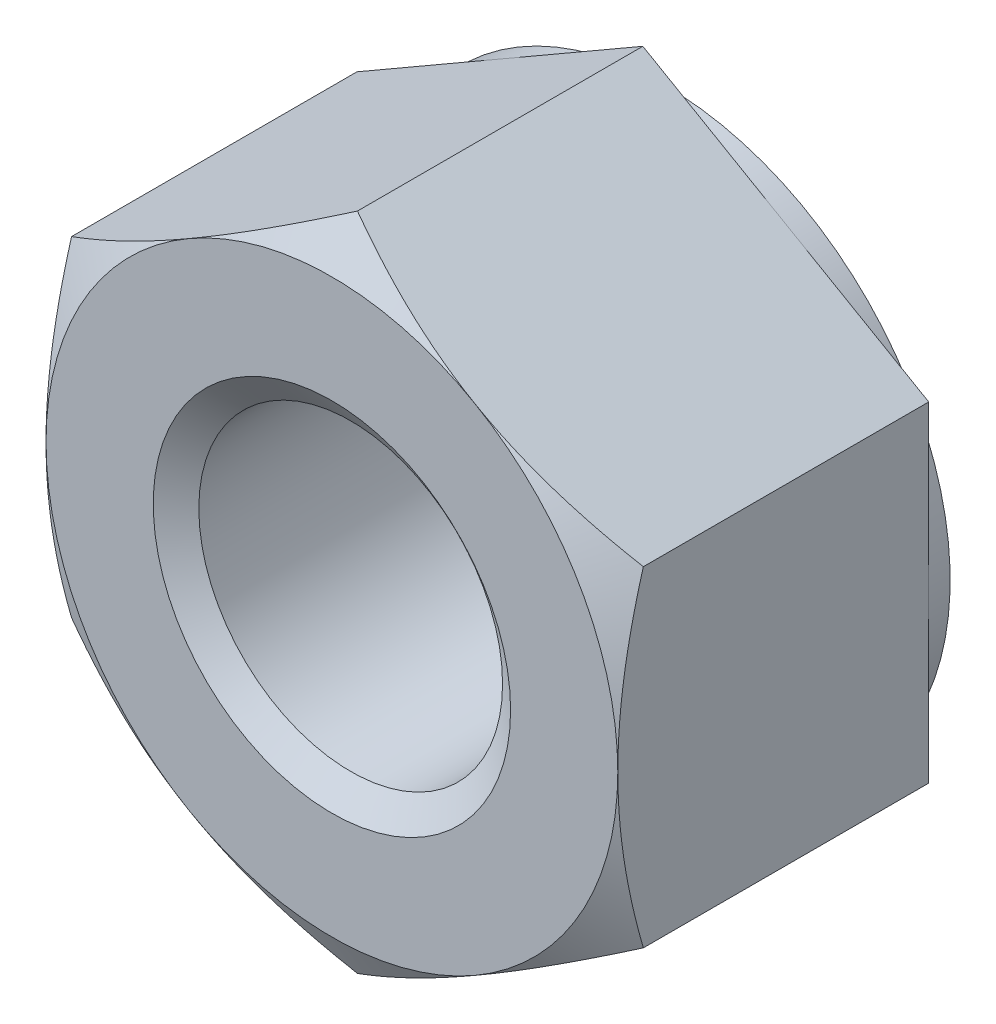
ISO-10303-21;
HEADER;
FILE_DESCRIPTION(('STEP AP214'),'2;1');
FILE_NAME('part.step','',(''),(''),'','','');
FILE_SCHEMA(('AUTOMOTIVE_DESIGN { 1 0 10303 214 1 1 1 1 }'));
ENDSEC;
DATA;
#1=APPLICATION_CONTEXT('core data for automotive mechanical design processes');
#2=APPLICATION_PROTOCOL_DEFINITION('international standard','automotive_design',2000,#1);
#3=PRODUCT_CONTEXT('',#1,'mechanical');
#4=PRODUCT('Part','Part','',(#3));
#5=PRODUCT_RELATED_PRODUCT_CATEGORY('part','',(#4));
#6=PRODUCT_DEFINITION_FORMATION('','',#4);
#7=PRODUCT_DEFINITION_CONTEXT('part definition',#1,'design');
#8=PRODUCT_DEFINITION('design','',#6,#7);
#9=PRODUCT_DEFINITION_SHAPE('','',#8);
#10=(LENGTH_UNIT() NAMED_UNIT(*) SI_UNIT(.MILLI.,.METRE.));
#11=(NAMED_UNIT(*) PLANE_ANGLE_UNIT() SI_UNIT($,.RADIAN.));
#12=(NAMED_UNIT(*) SI_UNIT($,.STERADIAN.) SOLID_ANGLE_UNIT());
#13=UNCERTAINTY_MEASURE_WITH_UNIT(LENGTH_MEASURE(1.E-05),#10,'distance_accuracy_value','');
#14=(GEOMETRIC_REPRESENTATION_CONTEXT(3) GLOBAL_UNCERTAINTY_ASSIGNED_CONTEXT((#13)) GLOBAL_UNIT_ASSIGNED_CONTEXT((#10,
#11,#12)) REPRESENTATION_CONTEXT('',''));
#15=CARTESIAN_POINT('',(0.,0.,0.));
#16=DIRECTION('',(0.,0.,1.));
#17=DIRECTION('',(1.,0.,0.));
#18=AXIS2_PLACEMENT_3D('',#15,#16,#17);
#19=CARTESIAN_POINT('',(0.,0.,-9.3));
#20=DIRECTION('',(0.,0.,1.));
#21=DIRECTION('',(1.,0.,0.));
#22=AXIS2_PLACEMENT_3D('',#19,#20,#21);
#23=CYLINDRICAL_SURFACE('',#22,4.25);
#24=CARTESIAN_POINT('',(0.,0.,-0.525155653657278));
#25=DIRECTION('',(0.,0.,1.));
#26=DIRECTION('',(1.,0.,0.));
#27=AXIS2_PLACEMENT_3D('',#24,#25,#26);
#28=CIRCLE('',#27,4.25);
#29=CARTESIAN_POINT('',(4.25,0.,-0.525155653657278));
#30=VERTEX_POINT('',#29);
#31=EDGE_CURVE('E154',#30,#30,#28,.F.);
#32=ORIENTED_EDGE('',*,*,#31,.F.);
#33=EDGE_LOOP('',(#32));
#34=FACE_BOUND('',#33,.T.);
#35=CARTESIAN_POINT('',(0.,0.,-8.74944434634271));
#36=DIRECTION('',(0.,0.,-1.));
#37=DIRECTION('',(-1.,0.,0.));
#38=AXIS2_PLACEMENT_3D('',#35,#36,#37);
#39=CIRCLE('',#38,4.25);
#40=CARTESIAN_POINT('',(-4.25,0.,-8.74944434634271));
#41=VERTEX_POINT('',#40);
#42=EDGE_CURVE('E42',#41,#41,#39,.F.);
#43=ORIENTED_EDGE('',*,*,#42,.F.);
#44=EDGE_LOOP('',(#43));
#45=FACE_BOUND('',#44,.T.);
#46=ADVANCED_FACE('F37',(#34,#45),#23,.F.);
#47=CARTESIAN_POINT('',(0.,9.23760430703403,-9.3));
#48=DIRECTION('',(-0.500000000000002,0.866025403784438,0.));
#49=DIRECTION('',(-0.866025403784438,-0.500000000000002,0.));
#50=AXIS2_PLACEMENT_3D('',#47,#48,#49);
#51=PLANE('',#50);
#52=DIRECTION('',(0.,0.,1.));
#53=VECTOR('',#52,1.);
#54=CARTESIAN_POINT('',(-8.,4.618802153517,-9.3));
#55=LINE('',#54,#53);
#56=CARTESIAN_POINT('',(-8.,4.618802153517,-8.7));
#57=VERTEX_POINT('',#56);
#58=CARTESIAN_POINT('',(-8.,4.618802153517,-0.714531179816336));
#59=VERTEX_POINT('',#58);
#60=EDGE_CURVE('E295',#57,#59,#55,.T.);
#61=ORIENTED_EDGE('',*,*,#60,.T.);
#62=CARTESIAN_POINT('',(-8.0002,4.61868668346316,-0.714597847732977));
#63=CARTESIAN_POINT('',(-7.8243512161201,4.72021302617289,-0.655990714047301));
#64=CARTESIAN_POINT('',(-7.64784680569387,4.82211789504563,-0.600043401047293));
#65=CARTESIAN_POINT('',(-7.29340453712154,5.02675523421805,-0.494201005024668));
#66=CARTESIAN_POINT('',(-7.11546609530729,5.12948804149869,-0.444308534431068));
#67=CARTESIAN_POINT('',(-6.57880176237736,5.43933133858026,-0.304692797206866));
#68=CARTESIAN_POINT('',(-6.21795741776428,5.64766491807817,-0.225281170978368));
#69=CARTESIAN_POINT('',(-5.67796082979595,5.95943209350317,-0.132161646294488));
#70=CARTESIAN_POINT('',(-5.50042181035672,6.06193429416807,-0.105634581029124));
#71=CARTESIAN_POINT('',(-5.1445408870398,6.26740224104454,-0.0611531748588752));
#72=CARTESIAN_POINT('',(-4.96619905550676,6.37036794548792,-0.043198076514579));
#73=CARTESIAN_POINT('',(-4.60920831517641,6.57647664551585,-0.0163156484918642));
#74=CARTESIAN_POINT('',(-4.4305599863905,6.67961930623067,-0.00737807354623307));
#75=CARTESIAN_POINT('',(-4.07309829490262,6.88599991003618,0.0012776960348698));
#76=CARTESIAN_POINT('',(-3.89428493746994,6.98923785008464,0.000996175497150101));
#77=CARTESIAN_POINT('',(-3.5599866329831,7.18224506616975,-0.00814502526877561));
#78=CARTESIAN_POINT('',(-3.40447809566133,7.27202796205376,-0.0158896043673698));
#79=CARTESIAN_POINT('',(-3.09382523825949,7.45138347289924,-0.0382011348534291));
#80=CARTESIAN_POINT('',(-2.93868094344,7.54095607327651,-0.0527685461381489));
#81=CARTESIAN_POINT('',(-2.47384868410518,7.80932710333149,-0.106360690527539));
#82=CARTESIAN_POINT('',(-2.16498351281828,7.98765049311728,-0.155268641669147));
#83=CARTESIAN_POINT('',(-1.5439767712397,8.34618890253625,-0.277539403234318));
#84=CARTESIAN_POINT('',(-1.23191445788552,8.52635816315522,-0.351420520376005));
#85=CARTESIAN_POINT('',(-0.612443518305235,8.88400987687705,-0.51910014125498));
#86=CARTESIAN_POINT('',(-0.305026959108242,9.06149691008278,-0.612859260854465));
#87=CARTESIAN_POINT('',(0.000200000000006873,9.23771977708786,-0.714597847732987));
#88=B_SPLINE_CURVE_WITH_KNOTS('',3,(#62,#63,#64,#65,#66,#67,#68,#69,#70,#71,#72,#73,#74,#75,#76,
#77,#78,#79,#80,#81,#82,#83,#84,#85,#86,#87),.UNSPECIFIED.,.F.,.F.,(4,2,2,2,2,2,2,2,2,2,2,2,4),
(0.,0.633973543721351,1.26821965714356,2.53934712434766,3.15934343977049,3.77928496069784,
4.39852133866766,5.01773858515595,5.55680239410249,6.09590254421148,7.17487077411836,
8.27776850154294,9.37850115249056),.UNSPECIFIED.);
#89=CARTESIAN_POINT('',(-4.00000000000001,6.9282032302755,0.));
#90=VERTEX_POINT('',#89);
#91=EDGE_CURVE('E61',#59,#90,#88,.T.);
#92=ORIENTED_EDGE('',*,*,#91,.T.);
#93=CARTESIAN_POINT('',(0.,9.23760430703403,-0.714531179816336));
#94=VERTEX_POINT('',#93);
#95=EDGE_CURVE('E168',#90,#94,#88,.T.);
#96=ORIENTED_EDGE('',*,*,#95,.T.);
#97=DIRECTION('',(0.,0.,1.));
#98=VECTOR('',#97,1.);
#99=CARTESIAN_POINT('',(0.,9.23760430703403,-9.3));
#100=LINE('',#99,#98);
#101=CARTESIAN_POINT('',(0.,9.23760430703403,-8.7));
#102=VERTEX_POINT('',#101);
#103=EDGE_CURVE('E283',#102,#94,#100,.T.);
#104=ORIENTED_EDGE('',*,*,#103,.F.);
#105=DIRECTION('',(-0.866025403784438,-0.500000000000002,0.));
#106=VECTOR('',#105,1.);
#107=CARTESIAN_POINT('',(0.,9.23760430703403,-8.7));
#108=LINE('',#107,#106);
#109=CARTESIAN_POINT('',(-4.00000000000001,6.9282032302755,-8.7));
#110=VERTEX_POINT('',#109);
#111=EDGE_CURVE('E271',#102,#110,#108,.T.);
#112=ORIENTED_EDGE('',*,*,#111,.T.);
#113=EDGE_CURVE('E267',#110,#57,#108,.T.);
#114=ORIENTED_EDGE('',*,*,#113,.T.);
#115=EDGE_LOOP('',(#61,#92,#96,#104,#112,#114));
#116=FACE_BOUND('',#115,.T.);
#117=ADVANCED_FACE('F39',(#116),#51,.T.);
#118=CARTESIAN_POINT('',(8.,4.61880215351699,-9.3));
#119=DIRECTION('',(0.500000000000003,0.866025403784437,0.));
#120=DIRECTION('',(-0.866025403784437,0.500000000000003,0.));
#121=AXIS2_PLACEMENT_3D('',#118,#119,#120);
#122=PLANE('',#121);
#123=ORIENTED_EDGE('',*,*,#103,.T.);
#124=CARTESIAN_POINT('',(-0.000199999999993257,9.23771977708786,-0.714597847732987));
#125=CARTESIAN_POINT('',(0.175648783879903,9.13619343437814,-0.655990714047311));
#126=CARTESIAN_POINT('',(0.352153194306141,9.03428856550539,-0.600043401047303));
#127=CARTESIAN_POINT('',(0.706595462878466,8.82965122633298,-0.494201005024677));
#128=CARTESIAN_POINT('',(0.884533904692719,8.72691841905234,-0.444308534431076));
#129=CARTESIAN_POINT('',(1.42119823762265,8.41707512197076,-0.304692797206873));
#130=CARTESIAN_POINT('',(1.78204258223573,8.20874154247285,-0.225281170978374));
#131=CARTESIAN_POINT('',(2.32203917020406,7.89697436704785,-0.132161646294492));
#132=CARTESIAN_POINT('',(2.49957818964329,7.79447216638295,-0.105634581029127));
#133=CARTESIAN_POINT('',(2.85545911296021,7.58900421950647,-0.0611531748588777));
#134=CARTESIAN_POINT('',(3.03380094449325,7.4860385150631,-0.0431980765145816));
#135=CARTESIAN_POINT('',(3.3907916848236,7.27992981503516,-0.0163156484918657));
#136=CARTESIAN_POINT('',(3.56944001360951,7.17678715432034,-0.0073780735462332));
#137=CARTESIAN_POINT('',(3.92690170509739,6.97040655051483,0.00127769603487092));
#138=CARTESIAN_POINT('',(4.10571506253007,6.86716861046637,0.000996175497151226));
#139=CARTESIAN_POINT('',(4.44001336701691,6.67416139438126,-0.00814502526877447));
#140=CARTESIAN_POINT('',(4.59552190433868,6.58437849849725,-0.0158896043673686));
#141=CARTESIAN_POINT('',(4.90617476174052,6.40502298765177,-0.0382011348534268));
#142=CARTESIAN_POINT('',(5.06131905656,6.31545038727451,-0.0527685461381455));
#143=CARTESIAN_POINT('',(5.52615131589482,6.04707935721953,-0.106360690527533));
#144=CARTESIAN_POINT('',(5.83501648718172,5.86875596743373,-0.155268641669142));
#145=CARTESIAN_POINT('',(6.4560232287603,5.51021755801476,-0.277539403234311));
#146=CARTESIAN_POINT('',(6.76808554211448,5.33004829739579,-0.351420520375996));
#147=CARTESIAN_POINT('',(7.38755648169476,4.97239658367396,-0.519100141254968));
#148=CARTESIAN_POINT('',(7.69497304089175,4.79490955046823,-0.612859260854452));
#149=CARTESIAN_POINT('',(8.0002,4.61868668346315,-0.714597847732974));
#150=B_SPLINE_CURVE_WITH_KNOTS('',3,(#124,#125,#126,#127,#128,#129,#130,#131,#132,#133,#134,
#135,#136,#137,#138,#139,#140,#141,#142,#143,#144,#145,#146,#147,#148,#149),.UNSPECIFIED.,.F.,
.F.,(4,2,2,2,2,2,2,2,2,2,2,2,4),(0.,0.633973543721352,1.26821965714356,2.53934712434766,
3.1593434397705,3.77928496069785,4.39852133866767,5.01773858515596,5.5568023941025,
6.09590254421149,7.17487077411836,8.27776850154294,9.37850115249056),.UNSPECIFIED.);
#151=CARTESIAN_POINT('',(4.00000000000002,6.9282032302755,0.));
#152=VERTEX_POINT('',#151);
#153=EDGE_CURVE('E165',#94,#152,#150,.T.);
#154=ORIENTED_EDGE('',*,*,#153,.T.);
#155=CARTESIAN_POINT('',(8.,4.61880215351703,-0.714531179816336));
#156=VERTEX_POINT('',#155);
#157=EDGE_CURVE('E148',#152,#156,#150,.T.);
#158=ORIENTED_EDGE('',*,*,#157,.T.);
#159=DIRECTION('',(0.,0.,1.));
#160=VECTOR('',#159,1.);
#161=CARTESIAN_POINT('',(8.,4.61880215351699,-9.3));
#162=LINE('',#161,#160);
#163=CARTESIAN_POINT('',(8.,4.61880215351699,-8.7));
#164=VERTEX_POINT('',#163);
#165=EDGE_CURVE('E164',#164,#156,#162,.T.);
#166=ORIENTED_EDGE('',*,*,#165,.F.);
#167=DIRECTION('',(-0.866025403784437,0.500000000000003,0.));
#168=VECTOR('',#167,1.);
#169=CARTESIAN_POINT('',(8.,4.61880215351699,-8.7));
#170=LINE('',#169,#168);
#171=CARTESIAN_POINT('',(4.00000000000002,6.9282032302755,-8.7));
#172=VERTEX_POINT('',#171);
#173=EDGE_CURVE('E279',#164,#172,#170,.T.);
#174=ORIENTED_EDGE('',*,*,#173,.T.);
#175=EDGE_CURVE('E275',#172,#102,#170,.T.);
#176=ORIENTED_EDGE('',*,*,#175,.T.);
#177=EDGE_LOOP('',(#123,#154,#158,#166,#174,#176));
#178=FACE_BOUND('',#177,.T.);
#179=ADVANCED_FACE('F242',(#178),#122,.T.);
#180=CARTESIAN_POINT('',(8.,4.61880215351699,-9.3));
#181=DIRECTION('',(-1.,0.,0.));
#182=DIRECTION('',(0.,0.,1.));
#183=AXIS2_PLACEMENT_3D('',#180,#181,#182);
#184=PLANE('',#183);
#185=CARTESIAN_POINT('',(8.,-12.2497439799177,-3.82821364248122));
#186=CARTESIAN_POINT('',(8.,-11.8984987351193,-3.65847254218266));
#187=CARTESIAN_POINT('',(8.,-11.5464230390783,-3.49041880793923));
#188=CARTESIAN_POINT('',(8.,-10.8401616983868,-3.15865029326974));
#189=CARTESIAN_POINT('',(8.,-10.4859757012546,-2.99493626408528));
#190=CARTESIAN_POINT('',(8.,-9.77313142803814,-2.67194892676994));
#191=CARTESIAN_POINT('',(8.,-9.41445915782848,-2.51270639241668));
#192=CARTESIAN_POINT('',(8.,-8.69416671490287,-2.20106116855006));
#193=CARTESIAN_POINT('',(8.,-8.33254669701139,-2.04865812250699));
#194=CARTESIAN_POINT('',(8.,-7.60129405984857,-1.7507013094022));
#195=CARTESIAN_POINT('',(8.,-7.2316175748596,-1.60525460075004));
#196=CARTESIAN_POINT('',(8.,-6.48790521752629,-1.32575242959684));
#197=CARTESIAN_POINT('',(8.,-6.11386886541895,-1.19169823445334));
#198=CARTESIAN_POINT('',(8.,-5.36160531585215,-0.938583617279796));
#199=CARTESIAN_POINT('',(8.,-4.98338896232053,-0.819491318535674));
#200=CARTESIAN_POINT('',(8.,-4.2215930034141,-0.600166264263341));
#201=CARTESIAN_POINT('',(8.,-3.83801513546607,-0.499927544676865));
#202=CARTESIAN_POINT('',(8.,-3.06517005833209,-0.323183265030146));
#203=CARTESIAN_POINT('',(8.,-2.67590136311897,-0.246684024227884));
#204=CARTESIAN_POINT('',(8.,-2.08857290362252,-0.153570158514917));
#205=CARTESIAN_POINT('',(8.,-1.89220175174279,-0.126136015174347));
#206=CARTESIAN_POINT('',(8.,-1.49853877384916,-0.0790191845115878));
#207=CARTESIAN_POINT('',(8.,-1.3012470409403,-0.0593357297923793));
#208=CARTESIAN_POINT('',(8.,-0.907261125171482,-0.0282499846394219));
#209=CARTESIAN_POINT('',(8.,-0.710571016085392,-0.0167962708107608));
#210=CARTESIAN_POINT('',(8.,-0.316882268583081,-0.0022305633436852));
#211=CARTESIAN_POINT('',(8.,-0.119883634206744,0.000881538622463729));
#212=CARTESIAN_POINT('',(8.,0.274012171056974,-0.00131013187964857));
#213=CARTESIAN_POINT('',(8.,0.47090935490336,-0.00661154245623651));
#214=CARTESIAN_POINT('',(8.,0.8643086583796,-0.0254984060979545));
#215=CARTESIAN_POINT('',(8.,1.06081075778876,-0.0390842728575164));
#216=CARTESIAN_POINT('',(8.,1.53707134445822,-0.0817685231184888));
#217=CARTESIAN_POINT('',(8.,1.81646391313846,-0.115017715431789));
#218=CARTESIAN_POINT('',(8.,2.37310809107455,-0.196418304991677));
#219=CARTESIAN_POINT('',(8.,2.65035909476176,-0.244573769774452));
#220=CARTESIAN_POINT('',(8.,3.20249141370949,-0.354078983931477));
#221=CARTESIAN_POINT('',(8.,3.47737023104608,-0.41544120858484));
#222=CARTESIAN_POINT('',(8.,4.02429975324249,-0.549487708331676));
#223=CARTESIAN_POINT('',(8.,4.29635072195127,-0.622170916833577));
#224=CARTESIAN_POINT('',(8.,4.84432510211611,-0.779020451442163));
#225=CARTESIAN_POINT('',(8.,5.12017997476409,-0.863424582160065));
#226=CARTESIAN_POINT('',(8.,5.6689739270833,-1.04057245964238));
#227=CARTESIAN_POINT('',(8.,5.94191487461246,-1.13331045423936));
#228=CARTESIAN_POINT('',(8.,6.48378576423056,-1.32521046517734));
#229=CARTESIAN_POINT('',(8.,6.7527296356523,-1.42433338468805));
#230=CARTESIAN_POINT('',(8.,7.28853074702745,-1.628397174615));
#231=CARTESIAN_POINT('',(8.,7.55538709319937,-1.73334039644852));
#232=CARTESIAN_POINT('',(8.,7.82127397973352,-1.84061801308352));
#233=B_SPLINE_CURVE_WITH_KNOTS('',3,(#185,#186,#187,#188,#189,#190,#191,#192,#193,#194,#195,
#196,#197,#198,#199,#200,#201,#202,#203,#204,#205,#206,#207,#208,#209,#210,#211,#212,#213,#214,
#215,#216,#217,#218,#219,#220,#221,#222,#223,#224,#225,#226,#227,#228,#229,#230,#231,#232),
.UNSPECIFIED.,.F.,.F.,(4,2,2,2,2,2,2,2,2,2,2,2,2,2,2,2,2,2,2,2,2,2,2,4),(0.,1.17034358506454,
2.3408884611985,3.51813189291972,4.69531388569647,5.88694801994964,7.07871454421368,
8.26789729395172,9.45670322782929,10.6458253413567,11.2405311012284,11.8351779643657,
12.4260760875167,13.0169665369752,13.6076911374644,14.1984452389235,15.0420672118768,
15.8859195906795,16.7305726096943,17.5751460989191,18.4404219096463,19.3051050140239,
20.1649211009824,21.0250871227256),.UNSPECIFIED.);
#234=CARTESIAN_POINT('',(7.99999999999999,-4.61880215351705,-0.714531179816336));
#235=VERTEX_POINT('',#234);
#236=CARTESIAN_POINT('',(8.,0.,0.));
#237=VERTEX_POINT('',#236);
#238=EDGE_CURVE('E129',#235,#237,#233,.T.);
#239=ORIENTED_EDGE('',*,*,#238,.F.);
#240=DIRECTION('',(0.,0.,1.));
#241=VECTOR('',#240,1.);
#242=CARTESIAN_POINT('',(8.,-4.61880215351704,-9.3));
#243=LINE('',#242,#241);
#244=CARTESIAN_POINT('',(8.,-4.61880215351704,-8.7));
#245=VERTEX_POINT('',#244);
#246=EDGE_CURVE('E288',#245,#235,#243,.T.);
#247=ORIENTED_EDGE('',*,*,#246,.F.);
#248=DIRECTION('',(0.,-1.,0.));
#249=VECTOR('',#248,1.);
#250=CARTESIAN_POINT('',(8.,4.61880215351699,-8.7));
#251=LINE('',#250,#249);
#252=CARTESIAN_POINT('',(8.,0.,-8.7));
#253=VERTEX_POINT('',#252);
#254=EDGE_CURVE('E280',#253,#245,#251,.T.);
#255=ORIENTED_EDGE('',*,*,#254,.F.);
#256=EDGE_CURVE('E282',#164,#253,#251,.T.);
#257=ORIENTED_EDGE('',*,*,#256,.F.);
#258=ORIENTED_EDGE('',*,*,#165,.T.);
#259=EDGE_CURVE('E142',#237,#156,#233,.T.);
#260=ORIENTED_EDGE('',*,*,#259,.F.);
#261=EDGE_LOOP('',(#239,#247,#255,#257,#258,#260));
#262=FACE_BOUND('',#261,.T.);
#263=ADVANCED_FACE('F161',(#262),#184,.F.);
#264=CARTESIAN_POINT('',(0.,-9.23760430703406,-9.3));
#265=DIRECTION('',(0.500000000000001,-0.866025403784438,0.));
#266=DIRECTION('',(0.866025403784438,0.500000000000001,0.));
#267=AXIS2_PLACEMENT_3D('',#264,#265,#266);
#268=PLANE('',#267);
#269=ORIENTED_EDGE('',*,*,#246,.T.);
#270=CARTESIAN_POINT('',(8.0002,-4.6186866834632,-0.714597847732991));
#271=CARTESIAN_POINT('',(7.82435121612011,-4.72021302617293,-0.655990714047315));
#272=CARTESIAN_POINT('',(7.64784680569387,-4.82211789504567,-0.600043401047307));
#273=CARTESIAN_POINT('',(7.29340453712154,-5.02675523421809,-0.494201005024683));
#274=CARTESIAN_POINT('',(7.11546609530729,-5.12948804149873,-0.444308534431083));
#275=CARTESIAN_POINT('',(6.57880176237736,-5.4393313385803,-0.304692797206883));
#276=CARTESIAN_POINT('',(6.21795741776427,-5.64766491807822,-0.225281170978386));
#277=CARTESIAN_POINT('',(5.67796082979595,-5.95943209350321,-0.132161646294506));
#278=CARTESIAN_POINT('',(5.50042181035671,-6.06193429416812,-0.105634581029141));
#279=CARTESIAN_POINT('',(5.1445408870398,-6.26740224104459,-0.0611531748588938));
#280=CARTESIAN_POINT('',(4.96619905550675,-6.37036794548796,-0.0431980765145988));
#281=CARTESIAN_POINT('',(4.6092083151764,-6.5764766455159,-0.0163156484918845));
#282=CARTESIAN_POINT('',(4.43055998639049,-6.67961930623072,-0.00737807354625271));
#283=CARTESIAN_POINT('',(4.07309829490261,-6.88599991003623,0.00127769603484986));
#284=CARTESIAN_POINT('',(3.89428493746993,-6.98923785008469,0.000996175497129267));
#285=CARTESIAN_POINT('',(3.55998663298309,-7.1822450661698,-0.00814502526879796));
#286=CARTESIAN_POINT('',(3.40447809566132,-7.27202796205381,-0.0158896043673928));
#287=CARTESIAN_POINT('',(3.09382523825948,-7.45138347289929,-0.0382011348534522));
#288=CARTESIAN_POINT('',(2.93868094343999,-7.54095607327655,-0.0527685461381716));
#289=CARTESIAN_POINT('',(2.47384868410518,-7.80932710333153,-0.106360690527561));
#290=CARTESIAN_POINT('',(2.16498351281827,-7.98765049311733,-0.155268641669171));
#291=CARTESIAN_POINT('',(1.5439767712397,-8.34618890253629,-0.277539403234342));
#292=CARTESIAN_POINT('',(1.23191445788552,-8.52635816315527,-0.351420520376029));
#293=CARTESIAN_POINT('',(0.612443518305239,-8.88400987687709,-0.519100141255002));
#294=CARTESIAN_POINT('',(0.305026959108247,-9.06149691008282,-0.612859260854486));
#295=CARTESIAN_POINT('',(-0.000200000000000967,-9.2377197770879,-0.714597847733008));
#296=B_SPLINE_CURVE_WITH_KNOTS('',3,(#270,#271,#272,#273,#274,#275,#276,#277,#278,#279,#280,
#281,#282,#283,#284,#285,#286,#287,#288,#289,#290,#291,#292,#293,#294,#295),.UNSPECIFIED.,.F.,
.F.,(4,2,2,2,2,2,2,2,2,2,2,2,4),(0.,0.633973543721353,1.26821965714357,2.53934712434767,
3.1593434397705,3.77928496069785,4.39852133866767,5.01773858515597,5.5568023941025,
6.09590254421149,7.17487077411836,8.27776850154294,9.37850115249056),.UNSPECIFIED.);
#297=CARTESIAN_POINT('',(4.00000000000001,-6.9282032302755,0.));
#298=VERTEX_POINT('',#297);
#299=EDGE_CURVE('E136',#235,#298,#296,.T.);
#300=ORIENTED_EDGE('',*,*,#299,.T.);
#301=CARTESIAN_POINT('',(0.,-9.23760430703403,-0.714531179816336));
#302=VERTEX_POINT('',#301);
#303=EDGE_CURVE('E176',#298,#302,#296,.T.);
#304=ORIENTED_EDGE('',*,*,#303,.T.);
#305=DIRECTION('',(0.,0.,1.));
#306=VECTOR('',#305,1.);
#307=CARTESIAN_POINT('',(0.,-9.23760430703406,-9.3));
#308=LINE('',#307,#306);
#309=CARTESIAN_POINT('',(0.,-9.23760430703406,-8.7));
#310=VERTEX_POINT('',#309);
#311=EDGE_CURVE('E290',#310,#302,#308,.T.);
#312=ORIENTED_EDGE('',*,*,#311,.F.);
#313=DIRECTION('',(0.866025403784438,0.500000000000001,0.));
#314=VECTOR('',#313,1.);
#315=CARTESIAN_POINT('',(0.,-9.23760430703406,-8.7));
#316=LINE('',#315,#314);
#317=CARTESIAN_POINT('',(4.00000000000003,-6.92820323027554,-8.7));
#318=VERTEX_POINT('',#317);
#319=EDGE_CURVE('E272',#310,#318,#316,.T.);
#320=ORIENTED_EDGE('',*,*,#319,.T.);
#321=EDGE_CURVE('E276',#318,#245,#316,.T.);
#322=ORIENTED_EDGE('',*,*,#321,.T.);
#323=EDGE_LOOP('',(#269,#300,#304,#312,#320,#322));
#324=FACE_BOUND('',#323,.T.);
#325=ADVANCED_FACE('F223',(#324),#268,.T.);
#326=CARTESIAN_POINT('',(-8.,-4.61880215351703,-9.3));
#327=DIRECTION('',(-0.500000000000003,-0.866025403784437,0.));
#328=DIRECTION('',(0.866025403784437,-0.500000000000003,0.));
#329=AXIS2_PLACEMENT_3D('',#326,#327,#328);
#330=PLANE('',#329);
#331=ORIENTED_EDGE('',*,*,#311,.T.);
#332=CARTESIAN_POINT('',(0.00019999999999848,-9.2377197770879,-0.71459784773301));
#333=CARTESIAN_POINT('',(-0.175648783879899,-9.13619343437818,-0.655990714047333));
#334=CARTESIAN_POINT('',(-0.352153194306138,-9.03428856550543,-0.600043401047325));
#335=CARTESIAN_POINT('',(-0.706595462878465,-8.82965122633301,-0.494201005024698));
#336=CARTESIAN_POINT('',(-0.884533904692718,-8.72691841905237,-0.444308534431098));
#337=CARTESIAN_POINT('',(-1.42119823762265,-8.4170751219708,-0.304692797206894));
#338=CARTESIAN_POINT('',(-1.78204258223573,-8.20874154247288,-0.225281170978395));
#339=CARTESIAN_POINT('',(-2.32203917020406,-7.89697436704789,-0.132161646294512));
#340=CARTESIAN_POINT('',(-2.4995781896433,-7.79447216638298,-0.105634581029147));
#341=CARTESIAN_POINT('',(-2.85545911296021,-7.5890042195065,-0.0611531748588969));
#342=CARTESIAN_POINT('',(-3.03380094449325,-7.48603851506313,-0.0431980765146005));
#343=CARTESIAN_POINT('',(-3.39079168482361,-7.2799298150352,-0.0163156484918843));
#344=CARTESIAN_POINT('',(-3.56944001360952,-7.17678715432037,-0.00737807354625183));
#345=CARTESIAN_POINT('',(-3.9269017050974,-6.97040655051486,0.00127769603485198));
#346=CARTESIAN_POINT('',(-4.10571506253009,-6.8671686104664,0.000996175497131971));
#347=CARTESIAN_POINT('',(-4.44001336701693,-6.67416139438129,-0.00814502526879351));
#348=CARTESIAN_POINT('',(-4.59552190433869,-6.58437849849728,-0.0158896043673872));
#349=CARTESIAN_POINT('',(-4.90617476174053,-6.4050229876518,-0.0382011348534448));
#350=CARTESIAN_POINT('',(-5.06131905656002,-6.31545038727454,-0.0527685461381634));
#351=CARTESIAN_POINT('',(-5.52615131589483,-6.04707935721956,-0.106360690527551));
#352=CARTESIAN_POINT('',(-5.83501648718173,-5.86875596743377,-0.155268641669158));
#353=CARTESIAN_POINT('',(-6.45602322876031,-5.5102175580148,-0.277539403234326));
#354=CARTESIAN_POINT('',(-6.76808554211448,-5.33004829739583,-0.351420520376011));
#355=CARTESIAN_POINT('',(-7.38755648169476,-4.972396583674,-0.519100141254982));
#356=CARTESIAN_POINT('',(-7.69497304089175,-4.79490955046827,-0.612859260854465));
#357=CARTESIAN_POINT('',(-8.0002,-4.61868668346319,-0.714597847732985));
#358=B_SPLINE_CURVE_WITH_KNOTS('',3,(#332,#333,#334,#335,#336,#337,#338,#339,#340,#341,#342,
#343,#344,#345,#346,#347,#348,#349,#350,#351,#352,#353,#354,#355,#356,#357),.UNSPECIFIED.,.F.,
.F.,(4,2,2,2,2,2,2,2,2,2,2,2,4),(0.,0.633973543721355,1.26821965714357,2.53934712434767,
3.15934343977051,3.77928496069786,4.39852133866769,5.01773858515599,5.55680239410252,
6.09590254421151,7.17487077411837,8.27776850154295,9.37850115249056),.UNSPECIFIED.);
#359=CARTESIAN_POINT('',(-4.00000000000002,-6.9282032302755,0.));
#360=VERTEX_POINT('',#359);
#361=EDGE_CURVE('E217',#302,#360,#358,.T.);
#362=ORIENTED_EDGE('',*,*,#361,.T.);
#363=CARTESIAN_POINT('',(-8.,-4.61880215351704,-0.714531179816336));
#364=VERTEX_POINT('',#363);
#365=EDGE_CURVE('E209',#360,#364,#358,.T.);
#366=ORIENTED_EDGE('',*,*,#365,.T.);
#367=DIRECTION('',(0.,0.,1.));
#368=VECTOR('',#367,1.);
#369=CARTESIAN_POINT('',(-8.,-4.61880215351703,-9.3));
#370=LINE('',#369,#368);
#371=CARTESIAN_POINT('',(-8.,-4.61880215351703,-8.7));
#372=VERTEX_POINT('',#371);
#373=EDGE_CURVE('E293',#372,#364,#370,.T.);
#374=ORIENTED_EDGE('',*,*,#373,.F.);
#375=DIRECTION('',(0.866025403784437,-0.500000000000003,0.));
#376=VECTOR('',#375,1.);
#377=CARTESIAN_POINT('',(-8.,-4.61880215351703,-8.7));
#378=LINE('',#377,#376);
#379=CARTESIAN_POINT('',(-4.00000000000004,-6.92820323027553,-8.7));
#380=VERTEX_POINT('',#379);
#381=EDGE_CURVE('E262',#372,#380,#378,.T.);
#382=ORIENTED_EDGE('',*,*,#381,.T.);
#383=EDGE_CURVE('E268',#380,#310,#378,.T.);
#384=ORIENTED_EDGE('',*,*,#383,.T.);
#385=EDGE_LOOP('',(#331,#362,#366,#374,#382,#384));
#386=FACE_BOUND('',#385,.T.);
#387=ADVANCED_FACE('F219',(#386),#330,.T.);
#388=CARTESIAN_POINT('',(-8.,4.618802153517,-9.3));
#389=DIRECTION('',(-1.,0.,0.));
#390=DIRECTION('',(0.,0.,1.));
#391=AXIS2_PLACEMENT_3D('',#388,#389,#390);
#392=PLANE('',#391);
#393=ORIENTED_EDGE('',*,*,#373,.T.);
#394=CARTESIAN_POINT('',(-8.,-12.2497439799177,-3.82821364248122));
#395=CARTESIAN_POINT('',(-8.,-11.8984987351192,-3.65847254218265));
#396=CARTESIAN_POINT('',(-8.,-11.5464230390783,-3.49041880793922));
#397=CARTESIAN_POINT('',(-8.,-10.8401616983868,-3.15865029326972));
#398=CARTESIAN_POINT('',(-8.,-10.4859757012545,-2.99493626408527));
#399=CARTESIAN_POINT('',(-8.,-9.77313142803813,-2.67194892676993));
#400=CARTESIAN_POINT('',(-8.,-9.41445915782846,-2.51270639241668));
#401=CARTESIAN_POINT('',(-8.,-8.69416671490286,-2.20106116855005));
#402=CARTESIAN_POINT('',(-8.,-8.33254669701137,-2.04865812250698));
#403=CARTESIAN_POINT('',(-8.,-7.60129405984856,-1.75070130940219));
#404=CARTESIAN_POINT('',(-8.,-7.2316175748596,-1.60525460075003));
#405=CARTESIAN_POINT('',(-8.,-6.48790521752628,-1.32575242959684));
#406=CARTESIAN_POINT('',(-8.,-6.11386886541894,-1.19169823445333));
#407=CARTESIAN_POINT('',(-8.,-5.36160531585214,-0.938583617279791));
#408=CARTESIAN_POINT('',(-8.,-4.98338896232052,-0.819491318535668));
#409=CARTESIAN_POINT('',(-8.,-4.22159300341409,-0.600166264263335));
#410=CARTESIAN_POINT('',(-8.,-3.83801513546606,-0.49992754467686));
#411=CARTESIAN_POINT('',(-8.,-3.06517005833208,-0.323183265030141));
#412=CARTESIAN_POINT('',(-8.,-2.67590136311896,-0.246684024227879));
#413=CARTESIAN_POINT('',(-8.,-2.08857290362251,-0.153570158514913));
#414=CARTESIAN_POINT('',(-8.,-1.89220175174278,-0.126136015174344));
#415=CARTESIAN_POINT('',(-8.,-1.49853877384915,-0.0790191845115847));
#416=CARTESIAN_POINT('',(-8.,-1.30124704094029,-0.0593357297923754));
#417=CARTESIAN_POINT('',(-8.,-0.907261125171473,-0.0282499846394178));
#418=CARTESIAN_POINT('',(-8.,-0.710571016085383,-0.0167962708107576));
#419=CARTESIAN_POINT('',(-8.,-0.316882268583073,-0.00223056334368244));
#420=CARTESIAN_POINT('',(-8.,-0.119883634206737,0.000881538622466866));
#421=CARTESIAN_POINT('',(-8.,0.27401217105698,-0.00131013187964569));
#422=CARTESIAN_POINT('',(-8.,0.470909354903366,-0.00661154245623428));
#423=CARTESIAN_POINT('',(-8.,0.864308658379605,-0.0254984060979528));
#424=CARTESIAN_POINT('',(-8.,1.06081075778876,-0.0390842728575145));
#425=CARTESIAN_POINT('',(-8.,1.53707134445823,-0.0817685231184867));
#426=CARTESIAN_POINT('',(-8.,1.81646391313847,-0.115017715431787));
#427=CARTESIAN_POINT('',(-8.,2.37310809107455,-0.196418304991675));
#428=CARTESIAN_POINT('',(-8.,2.65035909476177,-0.244573769774451));
#429=CARTESIAN_POINT('',(-8.,3.2024914137095,-0.354078983931476));
#430=CARTESIAN_POINT('',(-8.,3.47737023104609,-0.415441208584839));
#431=CARTESIAN_POINT('',(-8.,4.0242997532425,-0.549487708331675));
#432=CARTESIAN_POINT('',(-8.,4.29635072195127,-0.622170916833575));
#433=CARTESIAN_POINT('',(-8.,4.84432510211611,-0.779020451442161));
#434=CARTESIAN_POINT('',(-8.,5.1201799747641,-0.863424582160063));
#435=CARTESIAN_POINT('',(-8.,5.6689739270833,-1.04057245964238));
#436=CARTESIAN_POINT('',(-8.,5.94191487461246,-1.13331045423935));
#437=CARTESIAN_POINT('',(-8.,6.48378576423056,-1.32521046517734));
#438=CARTESIAN_POINT('',(-8.,6.7527296356523,-1.42433338468805));
#439=CARTESIAN_POINT('',(-8.,7.28853074702746,-1.628397174615));
#440=CARTESIAN_POINT('',(-8.,7.55538709319938,-1.73334039644852));
#441=CARTESIAN_POINT('',(-8.,7.82127397973352,-1.84061801308352));
#442=B_SPLINE_CURVE_WITH_KNOTS('',3,(#394,#395,#396,#397,#398,#399,#400,#401,#402,#403,#404,
#405,#406,#407,#408,#409,#410,#411,#412,#413,#414,#415,#416,#417,#418,#419,#420,#421,#422,#423,
#424,#425,#426,#427,#428,#429,#430,#431,#432,#433,#434,#435,#436,#437,#438,#439,#440,#441),
.UNSPECIFIED.,.F.,.F.,(4,2,2,2,2,2,2,2,2,2,2,2,2,2,2,2,2,2,2,2,2,2,2,4),(0.,1.17034358506454,
2.3408884611985,3.51813189291972,4.69531388569646,5.88694801994963,7.07871454421368,
8.26789729395171,9.45670322782928,10.6458253413567,11.2405311012284,11.8351779643657,
12.4260760875167,13.0169665369752,13.6076911374644,14.1984452389235,15.0420672118768,
15.8859195906795,16.7305726096943,17.5751460989191,18.4404219096463,19.3051050140239,
20.1649211009824,21.0250871227256),.UNSPECIFIED.);
#443=CARTESIAN_POINT('',(-8.,0.,0.));
#444=VERTEX_POINT('',#443);
#445=EDGE_CURVE('E218',#364,#444,#442,.T.);
#446=ORIENTED_EDGE('',*,*,#445,.T.);
#447=EDGE_CURVE('E153',#444,#59,#442,.T.);
#448=ORIENTED_EDGE('',*,*,#447,.T.);
#449=ORIENTED_EDGE('',*,*,#60,.F.);
#450=DIRECTION('',(0.,-1.,0.));
#451=VECTOR('',#450,1.);
#452=CARTESIAN_POINT('',(-8.,4.618802153517,-8.7));
#453=LINE('',#452,#451);
#454=CARTESIAN_POINT('',(-8.,0.,-8.7));
#455=VERTEX_POINT('',#454);
#456=EDGE_CURVE('E302',#57,#455,#453,.T.);
#457=ORIENTED_EDGE('',*,*,#456,.T.);
#458=EDGE_CURVE('E300',#455,#372,#453,.T.);
#459=ORIENTED_EDGE('',*,*,#458,.T.);
#460=EDGE_LOOP('',(#393,#446,#448,#449,#457,#459));
#461=FACE_BOUND('',#460,.T.);
#462=ADVANCED_FACE('F222',(#461),#392,.T.);
#463=CARTESIAN_POINT('',(0.,9.23760430703403,0.));
#464=DIRECTION('',(0.,0.,-1.));
#465=DIRECTION('',(-1.,0.,0.));
#466=AXIS2_PLACEMENT_3D('',#463,#464,#465);
#467=PLANE('',#466);
#468=CARTESIAN_POINT('',(0.,0.,0.));
#469=DIRECTION('',(0.,0.,1.));
#470=DIRECTION('',(1.,0.,0.));
#471=AXIS2_PLACEMENT_3D('',#468,#469,#470);
#472=CIRCLE('',#471,5.);
#473=CARTESIAN_POINT('',(5.,0.,0.));
#474=VERTEX_POINT('',#473);
#475=EDGE_CURVE('E305',#474,#474,#472,.T.);
#476=ORIENTED_EDGE('',*,*,#475,.F.);
#477=EDGE_LOOP('',(#476));
#478=FACE_BOUND('',#477,.T.);
#479=CARTESIAN_POINT('',(0.,0.,0.));
#480=DIRECTION('',(0.,0.,-1.));
#481=DIRECTION('',(-1.,0.,0.));
#482=AXIS2_PLACEMENT_3D('',#479,#480,#481);
#483=CIRCLE('',#482,8.);
#484=EDGE_CURVE('E49',#90,#444,#483,.F.);
#485=ORIENTED_EDGE('',*,*,#484,.T.);
#486=EDGE_CURVE('E12',#444,#360,#483,.F.);
#487=ORIENTED_EDGE('',*,*,#486,.T.);
#488=EDGE_CURVE('E47',#360,#298,#483,.F.);
#489=ORIENTED_EDGE('',*,*,#488,.T.);
#490=EDGE_CURVE('E133',#298,#237,#483,.F.);
#491=ORIENTED_EDGE('',*,*,#490,.T.);
#492=CARTESIAN_POINT('',(0.,0.,0.));
#493=DIRECTION('',(0.,0.,1.));
#494=DIRECTION('',(1.,0.,0.));
#495=AXIS2_PLACEMENT_3D('',#492,#493,#494);
#496=CIRCLE('',#495,8.);
#497=EDGE_CURVE('E145',#237,#152,#496,.T.);
#498=ORIENTED_EDGE('',*,*,#497,.T.);
#499=EDGE_CURVE('E159',#152,#90,#483,.F.);
#500=ORIENTED_EDGE('',*,*,#499,.T.);
#501=EDGE_LOOP('',(#485,#487,#489,#491,#498,#500));
#502=FACE_BOUND('',#501,.T.);
#503=ADVANCED_FACE('F157',(#478,#502),#467,.F.);
#504=CARTESIAN_POINT('',(0.,9.23760430703403,-9.3));
#505=DIRECTION('',(0.,0.,-1.));
#506=DIRECTION('',(-1.,0.,0.));
#507=AXIS2_PLACEMENT_3D('',#504,#505,#506);
#508=PLANE('',#507);
#509=CARTESIAN_POINT('',(0.,0.,-9.3));
#510=DIRECTION('',(0.,0.,-1.));
#511=DIRECTION('',(-1.,0.,0.));
#512=AXIS2_PLACEMENT_3D('',#509,#510,#511);
#513=CIRCLE('',#512,5.);
#514=CARTESIAN_POINT('',(-5.,0.,-9.3));
#515=VERTEX_POINT('',#514);
#516=EDGE_CURVE('E306',#515,#515,#513,.F.);
#517=ORIENTED_EDGE('',*,*,#516,.T.);
#518=EDGE_LOOP('',(#517));
#519=FACE_BOUND('',#518,.T.);
#520=CARTESIAN_POINT('',(0.,0.,-9.3));
#521=DIRECTION('',(0.,0.,-1.));
#522=DIRECTION('',(-1.,0.,0.));
#523=AXIS2_PLACEMENT_3D('',#520,#521,#522);
#524=CIRCLE('',#523,8.);
#525=CARTESIAN_POINT('',(-8.,0.,-9.3));
#526=VERTEX_POINT('',#525);
#527=EDGE_CURVE('E286',#526,#526,#524,.F.);
#528=ORIENTED_EDGE('',*,*,#527,.F.);
#529=EDGE_LOOP('',(#528));
#530=FACE_BOUND('',#529,.T.);
#531=ADVANCED_FACE('F232',(#519,#530),#508,.T.);
#532=CARTESIAN_POINT('',(0.,19.237604307034,-8.7));
#533=DIRECTION('',(0.,0.,-1.));
#534=DIRECTION('',(-1.,0.,0.));
#535=AXIS2_PLACEMENT_3D('',#532,#533,#534);
#536=PLANE('',#535);
#537=ORIENTED_EDGE('',*,*,#256,.T.);
#538=CARTESIAN_POINT('',(0.,0.,-8.7));
#539=DIRECTION('',(0.,0.,1.));
#540=DIRECTION('',(1.,0.,0.));
#541=AXIS2_PLACEMENT_3D('',#538,#539,#540);
#542=CIRCLE('',#541,8.);
#543=EDGE_CURVE('E259',#253,#172,#542,.T.);
#544=ORIENTED_EDGE('',*,*,#543,.T.);
#545=ORIENTED_EDGE('',*,*,#173,.F.);
#546=EDGE_LOOP('',(#537,#544,#545));
#547=FACE_BOUND('',#546,.T.);
#548=ADVANCED_FACE('F249',(#547),#536,.T.);
#549=ORIENTED_EDGE('',*,*,#254,.T.);
#550=ORIENTED_EDGE('',*,*,#321,.F.);
#551=EDGE_CURVE('E264',#318,#253,#542,.T.);
#552=ORIENTED_EDGE('',*,*,#551,.T.);
#553=EDGE_LOOP('',(#549,#550,#552));
#554=FACE_BOUND('',#553,.T.);
#555=ADVANCED_FACE('F452',(#554),#536,.T.);
#556=EDGE_CURVE('E263',#172,#110,#542,.T.);
#557=ORIENTED_EDGE('',*,*,#556,.T.);
#558=ORIENTED_EDGE('',*,*,#111,.F.);
#559=ORIENTED_EDGE('',*,*,#175,.F.);
#560=EDGE_LOOP('',(#557,#558,#559));
#561=FACE_BOUND('',#560,.T.);
#562=ADVANCED_FACE('F443',(#561),#536,.T.);
#563=ORIENTED_EDGE('',*,*,#383,.F.);
#564=EDGE_CURVE('E516',#380,#318,#542,.T.);
#565=ORIENTED_EDGE('',*,*,#564,.T.);
#566=ORIENTED_EDGE('',*,*,#319,.F.);
#567=EDGE_LOOP('',(#563,#565,#566));
#568=FACE_BOUND('',#567,.T.);
#569=ADVANCED_FACE('F434',(#568),#536,.T.);
#570=EDGE_CURVE('E530',#110,#455,#542,.T.);
#571=ORIENTED_EDGE('',*,*,#570,.T.);
#572=ORIENTED_EDGE('',*,*,#456,.F.);
#573=ORIENTED_EDGE('',*,*,#113,.F.);
#574=EDGE_LOOP('',(#571,#572,#573));
#575=FACE_BOUND('',#574,.T.);
#576=ADVANCED_FACE('F418',(#575),#536,.T.);
#577=CARTESIAN_POINT('',(0.,0.,0.));
#578=DIRECTION('',(0.,0.,1.));
#579=DIRECTION('',(1.,0.,0.));
#580=AXIS2_PLACEMENT_3D('',#577,#578,#579);
#581=CYLINDRICAL_SURFACE('',#580,8.);
#582=ORIENTED_EDGE('',*,*,#527,.T.);
#583=EDGE_LOOP('',(#582));
#584=FACE_BOUND('',#583,.T.);
#585=ORIENTED_EDGE('',*,*,#556,.F.);
#586=ORIENTED_EDGE('',*,*,#543,.F.);
#587=ORIENTED_EDGE('',*,*,#551,.F.);
#588=ORIENTED_EDGE('',*,*,#564,.F.);
#589=EDGE_CURVE('E532',#455,#380,#542,.T.);
#590=ORIENTED_EDGE('',*,*,#589,.F.);
#591=ORIENTED_EDGE('',*,*,#570,.F.);
#592=EDGE_LOOP('',(#585,#586,#587,#588,#590,#591));
#593=FACE_BOUND('',#592,.T.);
#594=ADVANCED_FACE('F247',(#584,#593),#581,.T.);
#595=ORIENTED_EDGE('',*,*,#458,.F.);
#596=ORIENTED_EDGE('',*,*,#589,.T.);
#597=ORIENTED_EDGE('',*,*,#381,.F.);
#598=EDGE_LOOP('',(#595,#596,#597));
#599=FACE_BOUND('',#598,.T.);
#600=ADVANCED_FACE('F198',(#599),#536,.T.);
#601=CARTESIAN_POINT('',(0.,0.,0.));
#602=DIRECTION('',(0.,0.,-1.));
#603=DIRECTION('',(-1.,0.,0.));
#604=AXIS2_PLACEMENT_3D('',#601,#602,#603);
#605=CONICAL_SURFACE('',#604,8.,1.0471975511966);
#606=ORIENTED_EDGE('',*,*,#447,.F.);
#607=ORIENTED_EDGE('',*,*,#484,.F.);
#608=ORIENTED_EDGE('',*,*,#91,.F.);
#609=EDGE_LOOP('',(#606,#607,#608));
#610=FACE_BOUND('',#609,.T.);
#611=ADVANCED_FACE('F380',(#610),#605,.T.);
#612=ORIENTED_EDGE('',*,*,#499,.F.);
#613=ORIENTED_EDGE('',*,*,#153,.F.);
#614=ORIENTED_EDGE('',*,*,#95,.F.);
#615=EDGE_LOOP('',(#612,#613,#614));
#616=FACE_BOUND('',#615,.T.);
#617=ADVANCED_FACE('F196',(#616),#605,.T.);
#618=ORIENTED_EDGE('',*,*,#497,.F.);
#619=ORIENTED_EDGE('',*,*,#259,.T.);
#620=ORIENTED_EDGE('',*,*,#157,.F.);
#621=EDGE_LOOP('',(#618,#619,#620));
#622=FACE_BOUND('',#621,.T.);
#623=ADVANCED_FACE('F146',(#622),#605,.T.);
#624=ORIENTED_EDGE('',*,*,#238,.T.);
#625=ORIENTED_EDGE('',*,*,#490,.F.);
#626=ORIENTED_EDGE('',*,*,#299,.F.);
#627=EDGE_LOOP('',(#624,#625,#626));
#628=FACE_BOUND('',#627,.T.);
#629=ADVANCED_FACE('F131',(#628),#605,.T.);
#630=ORIENTED_EDGE('',*,*,#488,.F.);
#631=ORIENTED_EDGE('',*,*,#361,.F.);
#632=ORIENTED_EDGE('',*,*,#303,.F.);
#633=EDGE_LOOP('',(#630,#631,#632));
#634=FACE_BOUND('',#633,.T.);
#635=ADVANCED_FACE('F195',(#634),#605,.T.);
#636=ORIENTED_EDGE('',*,*,#486,.F.);
#637=ORIENTED_EDGE('',*,*,#445,.F.);
#638=ORIENTED_EDGE('',*,*,#365,.F.);
#639=EDGE_LOOP('',(#636,#637,#638));
#640=FACE_BOUND('',#639,.T.);
#641=ADVANCED_FACE('F189',(#640),#605,.T.);
#642=CARTESIAN_POINT('',(0.,0.,-0.577671219023006));
#643=DIRECTION('',(0.,0.,1.));
#644=DIRECTION('',(1.,0.,0.));
#645=AXIS2_PLACEMENT_3D('',#642,#643,#644);
#646=CONICAL_SURFACE('',#645,4.175,0.959931088596882);
#647=ORIENTED_EDGE('',*,*,#475,.T.);
#648=EDGE_LOOP('',(#647));
#649=FACE_BOUND('',#648,.T.);
#650=ORIENTED_EDGE('',*,*,#31,.T.);
#651=EDGE_LOOP('',(#650));
#652=FACE_BOUND('',#651,.T.);
#653=ADVANCED_FACE('F194',(#649,#652),#646,.F.);
#654=CARTESIAN_POINT('',(0.,0.,-9.2746));
#655=DIRECTION('',(0.,0.,-1.));
#656=DIRECTION('',(-1.,0.,0.));
#657=AXIS2_PLACEMENT_3D('',#654,#655,#656);
#658=CONICAL_SURFACE('',#657,5.,0.959931088596879);
#659=CARTESIAN_POINT('',(0.,0.,-9.2746));
#660=DIRECTION('',(0.,0.,1.));
#661=DIRECTION('',(1.,0.,0.));
#662=AXIS2_PLACEMENT_3D('',#659,#660,#661);
#663=CIRCLE('',#662,5.);
#664=CARTESIAN_POINT('',(5.,0.,-9.2746));
#665=VERTEX_POINT('',#664);
#666=EDGE_CURVE('E308',#665,#665,#663,.T.);
#667=ORIENTED_EDGE('',*,*,#666,.F.);
#668=EDGE_LOOP('',(#667));
#669=FACE_BOUND('',#668,.T.);
#670=ORIENTED_EDGE('',*,*,#42,.T.);
#671=EDGE_LOOP('',(#670));
#672=FACE_BOUND('',#671,.T.);
#673=ADVANCED_FACE('F321',(#669,#672),#658,.F.);
#674=CARTESIAN_POINT('',(0.,0.,-25.0375057290932));
#675=DIRECTION('',(0.,0.,1.));
#676=DIRECTION('',(1.,0.,0.));
#677=AXIS2_PLACEMENT_3D('',#674,#675,#676);
#678=CYLINDRICAL_SURFACE('',#677,5.);
#679=ORIENTED_EDGE('',*,*,#516,.F.);
#680=EDGE_LOOP('',(#679));
#681=FACE_BOUND('',#680,.T.);
#682=ORIENTED_EDGE('',*,*,#666,.T.);
#683=EDGE_LOOP('',(#682));
#684=FACE_BOUND('',#683,.T.);
#685=ADVANCED_FACE('F325',(#681,#684),#678,.F.);
#686=CLOSED_SHELL('',(#46,#117,#179,#263,#325,#387,#462,#503,#531,#548,#555,#562,#569,#576,#594,
#600,#611,#617,#623,#629,#635,#641,#653,#673,#685));
#687=MANIFOLD_SOLID_BREP('B2',#686);
#688=ADVANCED_BREP_SHAPE_REPRESENTATION('',(#18,#687),#14);
#689=SHAPE_DEFINITION_REPRESENTATION(#9,#688);
ENDSEC;
END-ISO-10303-21;
